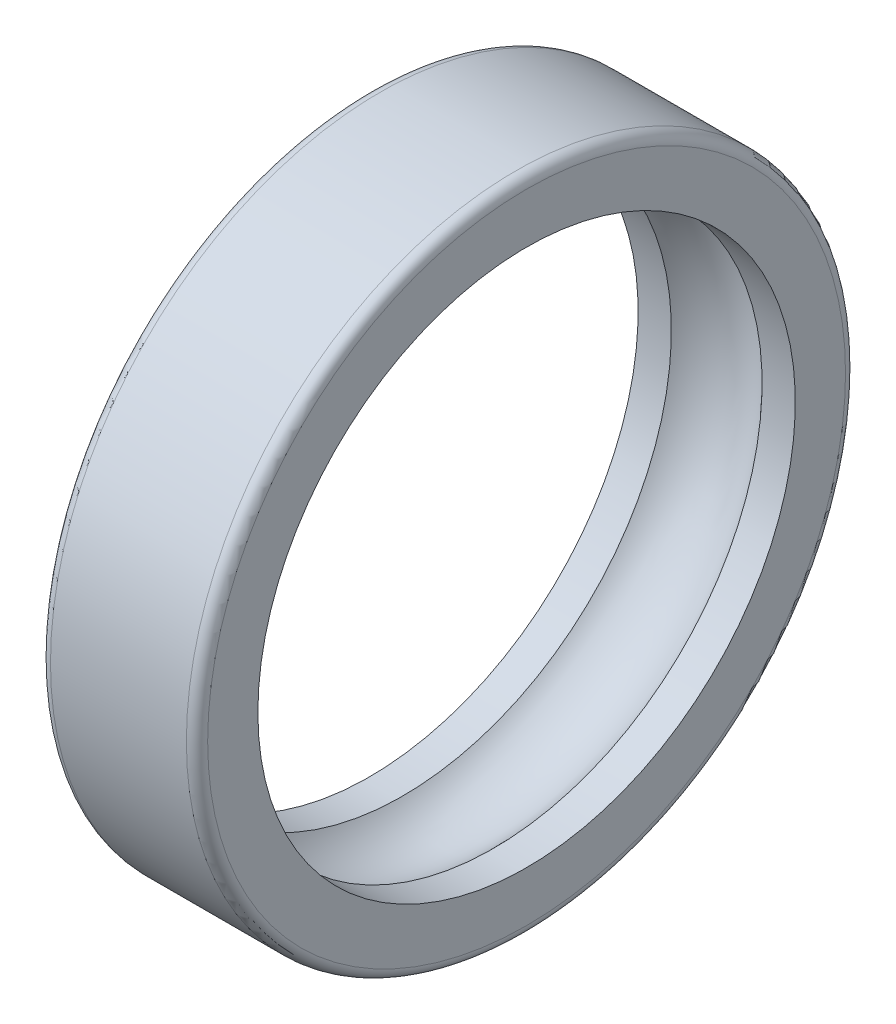
ISO-10303-21;
HEADER;
FILE_DESCRIPTION(('STEP AP214'),'2;1');
FILE_NAME('part.step','',(''),(''),'','','');
FILE_SCHEMA(('AUTOMOTIVE_DESIGN { 1 0 10303 214 1 1 1 1 }'));
ENDSEC;
DATA;
#1=APPLICATION_CONTEXT('core data for automotive mechanical design processes');
#2=APPLICATION_PROTOCOL_DEFINITION('international standard','automotive_design',2000,#1);
#3=PRODUCT_CONTEXT('',#1,'mechanical');
#4=PRODUCT('Part','Part','',(#3));
#5=PRODUCT_RELATED_PRODUCT_CATEGORY('part','',(#4));
#6=PRODUCT_DEFINITION_FORMATION('','',#4);
#7=PRODUCT_DEFINITION_CONTEXT('part definition',#1,'design');
#8=PRODUCT_DEFINITION('design','',#6,#7);
#9=PRODUCT_DEFINITION_SHAPE('','',#8);
#10=(LENGTH_UNIT() NAMED_UNIT(*) SI_UNIT(.MILLI.,.METRE.));
#11=(NAMED_UNIT(*) PLANE_ANGLE_UNIT() SI_UNIT($,.RADIAN.));
#12=(NAMED_UNIT(*) SI_UNIT($,.STERADIAN.) SOLID_ANGLE_UNIT());
#13=UNCERTAINTY_MEASURE_WITH_UNIT(LENGTH_MEASURE(1.E-05),#10,'distance_accuracy_value','');
#14=(GEOMETRIC_REPRESENTATION_CONTEXT(3) GLOBAL_UNCERTAINTY_ASSIGNED_CONTEXT((#13)) GLOBAL_UNIT_ASSIGNED_CONTEXT((#10,
#11,#12)) REPRESENTATION_CONTEXT('',''));
#15=CARTESIAN_POINT('',(0.,0.,0.));
#16=DIRECTION('',(0.,0.,1.));
#17=DIRECTION('',(1.,0.,0.));
#18=AXIS2_PLACEMENT_3D('',#15,#16,#17);
#19=CARTESIAN_POINT('',(15.5,53.,0.));
#20=DIRECTION('',(-1.,0.,0.));
#21=DIRECTION('',(0.,0.,1.));
#22=AXIS2_PLACEMENT_3D('',#19,#20,#21);
#23=PLANE('',#22);
#24=CARTESIAN_POINT('',(15.5,0.,0.));
#25=DIRECTION('',(-1.,0.,0.));
#26=DIRECTION('',(0.,0.,1.));
#27=AXIS2_PLACEMENT_3D('',#24,#25,#26);
#28=CIRCLE('',#27,62.9);
#29=CARTESIAN_POINT('',(15.5,0.,62.9));
#30=VERTEX_POINT('',#29);
#31=EDGE_CURVE('E38',#30,#30,#28,.F.);
#32=ORIENTED_EDGE('',*,*,#31,.T.);
#33=EDGE_LOOP('',(#32));
#34=FACE_BOUND('',#33,.T.);
#35=CARTESIAN_POINT('',(15.5,0.,0.));
#36=DIRECTION('',(-1.,0.,0.));
#37=DIRECTION('',(0.,0.,1.));
#38=AXIS2_PLACEMENT_3D('',#35,#36,#37);
#39=CIRCLE('',#38,53.);
#40=CARTESIAN_POINT('',(15.5,0.,53.));
#41=VERTEX_POINT('',#40);
#42=EDGE_CURVE('E51',#41,#41,#39,.T.);
#43=ORIENTED_EDGE('',*,*,#42,.T.);
#44=EDGE_LOOP('',(#43));
#45=FACE_BOUND('',#44,.T.);
#46=ADVANCED_FACE('F31',(#34,#45),#23,.F.);
#47=CARTESIAN_POINT('',(-31.3647621707432,0.,0.));
#48=DIRECTION('',(-1.,0.,0.));
#49=DIRECTION('',(0.,0.,1.));
#50=AXIS2_PLACEMENT_3D('',#47,#48,#49);
#51=CYLINDRICAL_SURFACE('',#50,53.);
#52=ORIENTED_EDGE('',*,*,#42,.F.);
#53=EDGE_LOOP('',(#52));
#54=FACE_BOUND('',#53,.T.);
#55=CARTESIAN_POINT('',(8.94427190999916,0.,0.));
#56=DIRECTION('',(-1.,0.,0.));
#57=DIRECTION('',(0.,0.,1.));
#58=AXIS2_PLACEMENT_3D('',#55,#56,#57);
#59=CIRCLE('',#58,53.);
#60=CARTESIAN_POINT('',(8.94427190999916,0.,53.));
#61=VERTEX_POINT('',#60);
#62=EDGE_CURVE('E54',#61,#61,#59,.T.);
#63=ORIENTED_EDGE('',*,*,#62,.T.);
#64=EDGE_LOOP('',(#63));
#65=FACE_BOUND('',#64,.T.);
#66=ADVANCED_FACE('F81',(#54,#65),#51,.F.);
#67=CARTESIAN_POINT('',(0.,0.,0.));
#68=DIRECTION('',(-1.,0.,0.));
#69=DIRECTION('',(0.,0.,1.));
#70=AXIS2_PLACEMENT_3D('',#67,#68,#69);
#71=TOROIDAL_SURFACE('',#70,45.,12.);
#72=ORIENTED_EDGE('',*,*,#62,.F.);
#73=EDGE_LOOP('',(#72));
#74=FACE_BOUND('',#73,.T.);
#75=CARTESIAN_POINT('',(-8.94427190999916,0.,0.));
#76=DIRECTION('',(-1.,0.,0.));
#77=DIRECTION('',(0.,0.,1.));
#78=AXIS2_PLACEMENT_3D('',#75,#76,#77);
#79=CIRCLE('',#78,53.);
#80=CARTESIAN_POINT('',(-8.94427190999916,0.,53.));
#81=VERTEX_POINT('',#80);
#82=EDGE_CURVE('E57',#81,#81,#79,.T.);
#83=ORIENTED_EDGE('',*,*,#82,.T.);
#84=EDGE_LOOP('',(#83));
#85=FACE_BOUND('',#84,.T.);
#86=ADVANCED_FACE('F77',(#74,#85),#71,.F.);
#87=CARTESIAN_POINT('',(-31.3647621707432,0.,0.));
#88=DIRECTION('',(-1.,0.,0.));
#89=DIRECTION('',(0.,0.,1.));
#90=AXIS2_PLACEMENT_3D('',#87,#88,#89);
#91=CYLINDRICAL_SURFACE('',#90,53.);
#92=ORIENTED_EDGE('',*,*,#82,.F.);
#93=EDGE_LOOP('',(#92));
#94=FACE_BOUND('',#93,.T.);
#95=CARTESIAN_POINT('',(-15.5,0.,0.));
#96=DIRECTION('',(-1.,0.,0.));
#97=DIRECTION('',(0.,0.,1.));
#98=AXIS2_PLACEMENT_3D('',#95,#96,#97);
#99=CIRCLE('',#98,53.);
#100=CARTESIAN_POINT('',(-15.5,0.,53.));
#101=VERTEX_POINT('',#100);
#102=EDGE_CURVE('E60',#101,#101,#99,.T.);
#103=ORIENTED_EDGE('',*,*,#102,.T.);
#104=EDGE_LOOP('',(#103));
#105=FACE_BOUND('',#104,.T.);
#106=ADVANCED_FACE('F64',(#94,#105),#91,.F.);
#107=CARTESIAN_POINT('',(-15.5,53.,0.));
#108=DIRECTION('',(1.,0.,0.));
#109=DIRECTION('',(0.,0.,-1.));
#110=AXIS2_PLACEMENT_3D('',#107,#108,#109);
#111=PLANE('',#110);
#112=CARTESIAN_POINT('',(-15.5,0.,0.));
#113=DIRECTION('',(1.,0.,0.));
#114=DIRECTION('',(0.,0.,-1.));
#115=AXIS2_PLACEMENT_3D('',#112,#113,#114);
#116=CIRCLE('',#115,62.9);
#117=CARTESIAN_POINT('',(-15.5,0.,-62.9));
#118=VERTEX_POINT('',#117);
#119=EDGE_CURVE('E10',#118,#118,#116,.F.);
#120=ORIENTED_EDGE('',*,*,#119,.T.);
#121=EDGE_LOOP('',(#120));
#122=FACE_BOUND('',#121,.T.);
#123=ORIENTED_EDGE('',*,*,#102,.F.);
#124=EDGE_LOOP('',(#123));
#125=FACE_BOUND('',#124,.T.);
#126=ADVANCED_FACE('F66',(#122,#125),#111,.F.);
#127=CARTESIAN_POINT('',(-31.3647621707432,0.,0.));
#128=DIRECTION('',(-1.,0.,0.));
#129=DIRECTION('',(0.,0.,1.));
#130=AXIS2_PLACEMENT_3D('',#127,#128,#129);
#131=CYLINDRICAL_SURFACE('',#130,65.);
#132=CARTESIAN_POINT('',(13.4,0.,0.));
#133=DIRECTION('',(-1.,0.,0.));
#134=DIRECTION('',(0.,0.,1.));
#135=AXIS2_PLACEMENT_3D('',#132,#133,#134);
#136=CIRCLE('',#135,65.);
#137=CARTESIAN_POINT('',(13.4,0.,65.));
#138=VERTEX_POINT('',#137);
#139=EDGE_CURVE('E42',#138,#138,#136,.T.);
#140=ORIENTED_EDGE('',*,*,#139,.T.);
#141=EDGE_LOOP('',(#140));
#142=FACE_BOUND('',#141,.T.);
#143=CARTESIAN_POINT('',(-13.4,0.,0.));
#144=DIRECTION('',(1.,0.,0.));
#145=DIRECTION('',(0.,0.,-1.));
#146=AXIS2_PLACEMENT_3D('',#143,#144,#145);
#147=CIRCLE('',#146,65.);
#148=CARTESIAN_POINT('',(-13.4,0.,-65.));
#149=VERTEX_POINT('',#148);
#150=EDGE_CURVE('E46',#149,#149,#147,.T.);
#151=ORIENTED_EDGE('',*,*,#150,.T.);
#152=EDGE_LOOP('',(#151));
#153=FACE_BOUND('',#152,.T.);
#154=ADVANCED_FACE('F68',(#142,#153),#131,.T.);
#155=CARTESIAN_POINT('',(13.4,0.,0.));
#156=DIRECTION('',(-1.,0.,0.));
#157=DIRECTION('',(0.,0.,1.));
#158=AXIS2_PLACEMENT_3D('',#155,#156,#157);
#159=TOROIDAL_SURFACE('',#158,62.9,2.1);
#160=ORIENTED_EDGE('',*,*,#31,.F.);
#161=EDGE_LOOP('',(#160));
#162=FACE_BOUND('',#161,.T.);
#163=ORIENTED_EDGE('',*,*,#139,.F.);
#164=EDGE_LOOP('',(#163));
#165=FACE_BOUND('',#164,.T.);
#166=ADVANCED_FACE('F74',(#162,#165),#159,.T.);
#167=CARTESIAN_POINT('',(-13.4,0.,0.));
#168=DIRECTION('',(1.,0.,0.));
#169=DIRECTION('',(0.,0.,-1.));
#170=AXIS2_PLACEMENT_3D('',#167,#168,#169);
#171=TOROIDAL_SURFACE('',#170,62.9,2.1);
#172=ORIENTED_EDGE('',*,*,#150,.F.);
#173=EDGE_LOOP('',(#172));
#174=FACE_BOUND('',#173,.T.);
#175=ORIENTED_EDGE('',*,*,#119,.F.);
#176=EDGE_LOOP('',(#175));
#177=FACE_BOUND('',#176,.T.);
#178=ADVANCED_FACE('F33',(#174,#177),#171,.T.);
#179=CLOSED_SHELL('',(#46,#66,#86,#106,#126,#154,#166,#178));
#180=MANIFOLD_SOLID_BREP('B2',#179);
#181=ADVANCED_BREP_SHAPE_REPRESENTATION('',(#18,#180),#14);
#182=SHAPE_DEFINITION_REPRESENTATION(#9,#181);
ENDSEC;
END-ISO-10303-21;
